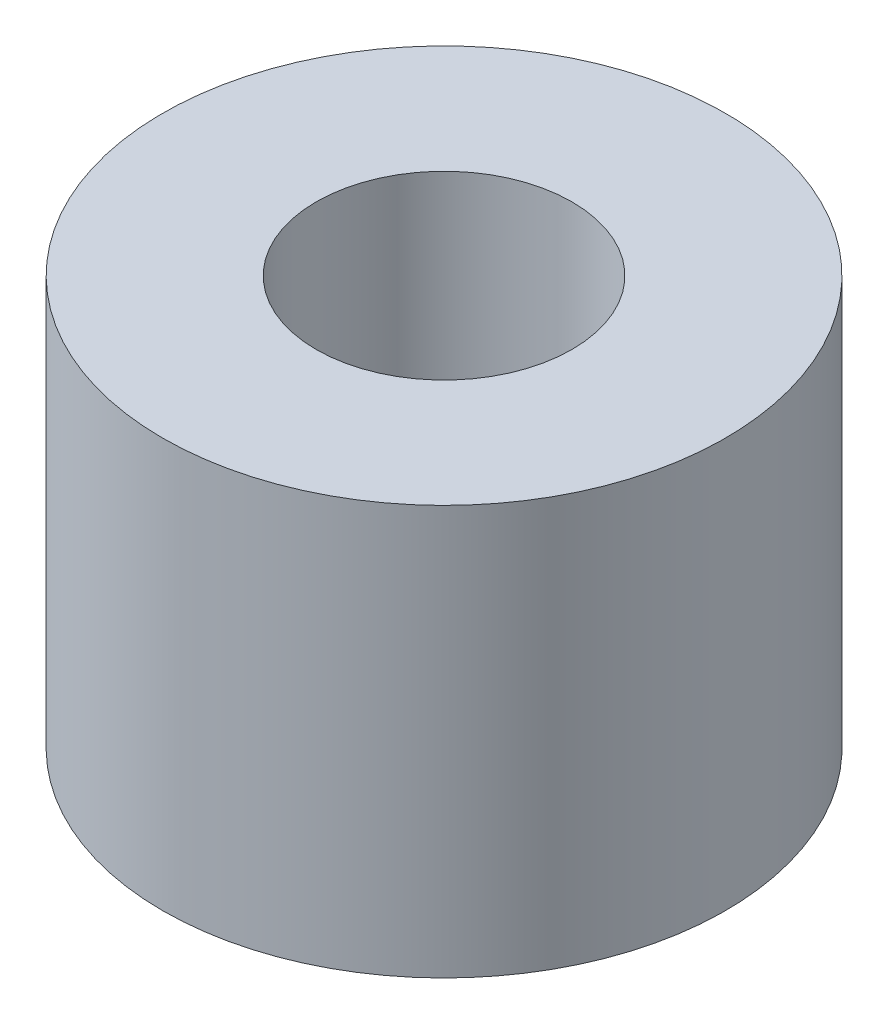
ISO-10303-21;
HEADER;
FILE_DESCRIPTION(('STEP AP214'),'2;1');
FILE_NAME('part.step','',(''),(''),'','','');
FILE_SCHEMA(('AUTOMOTIVE_DESIGN { 1 0 10303 214 1 1 1 1 }'));
ENDSEC;
DATA;
#1=APPLICATION_CONTEXT('core data for automotive mechanical design processes');
#2=APPLICATION_PROTOCOL_DEFINITION('international standard','automotive_design',2000,#1);
#3=PRODUCT_CONTEXT('',#1,'mechanical');
#4=PRODUCT('Part','Part','',(#3));
#5=PRODUCT_RELATED_PRODUCT_CATEGORY('part','',(#4));
#6=PRODUCT_DEFINITION_FORMATION('','',#4);
#7=PRODUCT_DEFINITION_CONTEXT('part definition',#1,'design');
#8=PRODUCT_DEFINITION('design','',#6,#7);
#9=PRODUCT_DEFINITION_SHAPE('','',#8);
#10=(LENGTH_UNIT() NAMED_UNIT(*) SI_UNIT(.MILLI.,.METRE.));
#11=(NAMED_UNIT(*) PLANE_ANGLE_UNIT() SI_UNIT($,.RADIAN.));
#12=(NAMED_UNIT(*) SI_UNIT($,.STERADIAN.) SOLID_ANGLE_UNIT());
#13=UNCERTAINTY_MEASURE_WITH_UNIT(LENGTH_MEASURE(1.E-05),#10,'distance_accuracy_value','');
#14=(GEOMETRIC_REPRESENTATION_CONTEXT(3) GLOBAL_UNCERTAINTY_ASSIGNED_CONTEXT((#13)) GLOBAL_UNIT_ASSIGNED_CONTEXT((#10,
#11,#12)) REPRESENTATION_CONTEXT('',''));
#15=CARTESIAN_POINT('',(0.,0.,0.));
#16=DIRECTION('',(0.,0.,1.));
#17=DIRECTION('',(1.,0.,0.));
#18=AXIS2_PLACEMENT_3D('',#15,#16,#17);
#19=CARTESIAN_POINT('',(0.,8.,0.));
#20=DIRECTION('',(0.,1.,0.));
#21=DIRECTION('',(0.,0.,1.));
#22=AXIS2_PLACEMENT_3D('',#19,#20,#21);
#23=PLANE('',#22);
#24=CARTESIAN_POINT('',(0.,8.,0.));
#25=DIRECTION('',(0.,1.,0.));
#26=DIRECTION('',(0.,0.,1.));
#27=AXIS2_PLACEMENT_3D('',#24,#25,#26);
#28=CIRCLE('',#27,5.5);
#29=CARTESIAN_POINT('',(0.,8.,5.5));
#30=VERTEX_POINT('',#29);
#31=EDGE_CURVE('E10',#30,#30,#28,.T.);
#32=ORIENTED_EDGE('',*,*,#31,.T.);
#33=EDGE_LOOP('',(#32));
#34=FACE_BOUND('',#33,.T.);
#35=CARTESIAN_POINT('',(0.,8.,0.));
#36=DIRECTION('',(0.,1.,0.));
#37=DIRECTION('',(0.,0.,1.));
#38=AXIS2_PLACEMENT_3D('',#35,#36,#37);
#39=CIRCLE('',#38,2.5);
#40=CARTESIAN_POINT('',(0.,8.,2.5));
#41=VERTEX_POINT('',#40);
#42=EDGE_CURVE('E44',#41,#41,#39,.T.);
#43=ORIENTED_EDGE('',*,*,#42,.F.);
#44=EDGE_LOOP('',(#43));
#45=FACE_BOUND('',#44,.T.);
#46=ADVANCED_FACE('F33',(#34,#45),#23,.T.);
#47=CARTESIAN_POINT('',(0.,0.,0.));
#48=DIRECTION('',(0.,1.,0.));
#49=DIRECTION('',(0.,0.,1.));
#50=AXIS2_PLACEMENT_3D('',#47,#48,#49);
#51=PLANE('',#50);
#52=CARTESIAN_POINT('',(0.,0.,0.));
#53=DIRECTION('',(0.,1.,0.));
#54=DIRECTION('',(0.,0.,1.));
#55=AXIS2_PLACEMENT_3D('',#52,#53,#54);
#56=CIRCLE('',#55,5.5);
#57=CARTESIAN_POINT('',(0.,0.,5.5));
#58=VERTEX_POINT('',#57);
#59=EDGE_CURVE('E37',#58,#58,#56,.T.);
#60=ORIENTED_EDGE('',*,*,#59,.F.);
#61=EDGE_LOOP('',(#60));
#62=FACE_BOUND('',#61,.T.);
#63=CARTESIAN_POINT('',(0.,0.,0.));
#64=DIRECTION('',(0.,1.,0.));
#65=DIRECTION('',(0.,0.,1.));
#66=AXIS2_PLACEMENT_3D('',#63,#64,#65);
#67=CIRCLE('',#66,2.5);
#68=CARTESIAN_POINT('',(0.,0.,2.5));
#69=VERTEX_POINT('',#68);
#70=EDGE_CURVE('E46',#69,#69,#67,.T.);
#71=ORIENTED_EDGE('',*,*,#70,.T.);
#72=EDGE_LOOP('',(#71));
#73=FACE_BOUND('',#72,.T.);
#74=ADVANCED_FACE('F56',(#62,#73),#51,.F.);
#75=CARTESIAN_POINT('',(0.,8.,0.));
#76=DIRECTION('',(0.,-1.,0.));
#77=DIRECTION('',(0.,0.,-1.));
#78=AXIS2_PLACEMENT_3D('',#75,#76,#77);
#79=CYLINDRICAL_SURFACE('',#78,5.5);
#80=ORIENTED_EDGE('',*,*,#31,.F.);
#81=EDGE_LOOP('',(#80));
#82=FACE_BOUND('',#81,.T.);
#83=ORIENTED_EDGE('',*,*,#59,.T.);
#84=EDGE_LOOP('',(#83));
#85=FACE_BOUND('',#84,.T.);
#86=ADVANCED_FACE('F35',(#82,#85),#79,.T.);
#87=CARTESIAN_POINT('',(0.,8.,0.));
#88=DIRECTION('',(0.,-1.,0.));
#89=DIRECTION('',(0.,0.,-1.));
#90=AXIS2_PLACEMENT_3D('',#87,#88,#89);
#91=CYLINDRICAL_SURFACE('',#90,2.5);
#92=ORIENTED_EDGE('',*,*,#42,.T.);
#93=EDGE_LOOP('',(#92));
#94=FACE_BOUND('',#93,.T.);
#95=ORIENTED_EDGE('',*,*,#70,.F.);
#96=EDGE_LOOP('',(#95));
#97=FACE_BOUND('',#96,.T.);
#98=ADVANCED_FACE('F52',(#94,#97),#91,.F.);
#99=CLOSED_SHELL('',(#46,#74,#86,#98));
#100=MANIFOLD_SOLID_BREP('B2',#99);
#101=ADVANCED_BREP_SHAPE_REPRESENTATION('',(#18,#100),#14);
#102=SHAPE_DEFINITION_REPRESENTATION(#9,#101);
ENDSEC;
END-ISO-10303-21;
